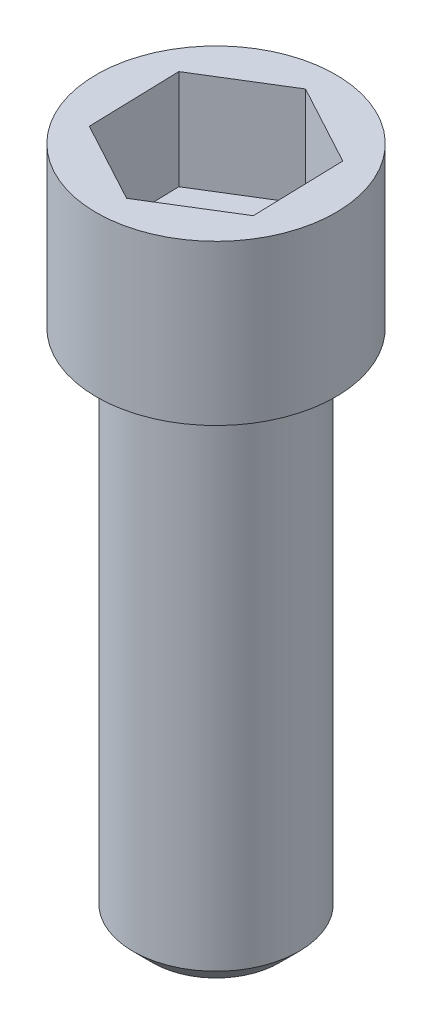
ISO-10303-21;
HEADER;
FILE_DESCRIPTION(('STEP AP214'),'2;1');
FILE_NAME('part.step','',(''),(''),'','','');
FILE_SCHEMA(('AUTOMOTIVE_DESIGN { 1 0 10303 214 1 1 1 1 }'));
ENDSEC;
DATA;
#1=APPLICATION_CONTEXT('core data for automotive mechanical design processes');
#2=APPLICATION_PROTOCOL_DEFINITION('international standard','automotive_design',2000,#1);
#3=PRODUCT_CONTEXT('',#1,'mechanical');
#4=PRODUCT('Part','Part','',(#3));
#5=PRODUCT_RELATED_PRODUCT_CATEGORY('part','',(#4));
#6=PRODUCT_DEFINITION_FORMATION('','',#4);
#7=PRODUCT_DEFINITION_CONTEXT('part definition',#1,'design');
#8=PRODUCT_DEFINITION('design','',#6,#7);
#9=PRODUCT_DEFINITION_SHAPE('','',#8);
#10=(LENGTH_UNIT() NAMED_UNIT(*) SI_UNIT(.MILLI.,.METRE.));
#11=(NAMED_UNIT(*) PLANE_ANGLE_UNIT() SI_UNIT($,.RADIAN.));
#12=(NAMED_UNIT(*) SI_UNIT($,.STERADIAN.) SOLID_ANGLE_UNIT());
#13=UNCERTAINTY_MEASURE_WITH_UNIT(LENGTH_MEASURE(1.E-05),#10,'distance_accuracy_value','');
#14=(GEOMETRIC_REPRESENTATION_CONTEXT(3) GLOBAL_UNCERTAINTY_ASSIGNED_CONTEXT((#13)) GLOBAL_UNIT_ASSIGNED_CONTEXT((#10,
#11,#12)) REPRESENTATION_CONTEXT('',''));
#15=CARTESIAN_POINT('',(0.,0.,0.));
#16=DIRECTION('',(0.,0.,1.));
#17=DIRECTION('',(1.,0.,0.));
#18=AXIS2_PLACEMENT_3D('',#15,#16,#17);
#19=CARTESIAN_POINT('',(0.,6.5,0.));
#20=DIRECTION('',(0.,-1.,0.));
#21=DIRECTION('',(0.,0.,-1.));
#22=AXIS2_PLACEMENT_3D('',#19,#20,#21);
#23=CYLINDRICAL_SURFACE('',#22,1.04);
#24=CARTESIAN_POINT('',(0.,0.250000000000005,0.));
#25=DIRECTION('',(0.,1.,0.));
#26=DIRECTION('',(0.,0.,1.));
#27=AXIS2_PLACEMENT_3D('',#24,#25,#26);
#28=CIRCLE('',#27,1.04);
#29=CARTESIAN_POINT('',(0.,0.250000000000005,-1.04));
#30=VERTEX_POINT('',#29);
#31=EDGE_CURVE('E40',#30,#30,#28,.T.);
#32=CARTESIAN_POINT('',(0.,6.5,0.));
#33=DIRECTION('',(0.,1.,0.));
#34=DIRECTION('',(0.,0.,1.));
#35=AXIS2_PLACEMENT_3D('',#32,#33,#34);
#36=CIRCLE('',#35,1.04);
#37=CARTESIAN_POINT('',(0.,6.5,-1.04));
#38=VERTEX_POINT('',#37);
#39=EDGE_CURVE('E143',#38,#38,#36,.T.);
#40=CARTESIAN_POINT('',(0.,0.250000000000005,-1.04));
#41=CARTESIAN_POINT('',(0.,0.315104166666672,-1.04));
#42=CARTESIAN_POINT('',(0.,0.380208333333339,-1.04));
#43=CARTESIAN_POINT('',(0.,0.510416666666672,-1.04));
#44=CARTESIAN_POINT('',(0.,0.575520833333338,-1.04));
#45=CARTESIAN_POINT('',(0.,0.705729166666672,-1.04));
#46=CARTESIAN_POINT('',(0.,0.770833333333338,-1.04));
#47=CARTESIAN_POINT('',(0.,0.901041666666672,-1.04));
#48=CARTESIAN_POINT('',(0.,0.966145833333338,-1.04));
#49=CARTESIAN_POINT('',(0.,1.09635416666667,-1.04));
#50=CARTESIAN_POINT('',(0.,1.16145833333334,-1.04));
#51=CARTESIAN_POINT('',(0.,1.29166666666667,-1.04));
#52=CARTESIAN_POINT('',(0.,1.35677083333334,-1.04));
#53=CARTESIAN_POINT('',(0.,1.48697916666667,-1.04));
#54=CARTESIAN_POINT('',(0.,1.55208333333334,-1.04));
#55=CARTESIAN_POINT('',(0.,1.68229166666667,-1.04));
#56=CARTESIAN_POINT('',(0.,1.74739583333334,-1.04));
#57=CARTESIAN_POINT('',(0.,1.87760416666667,-1.04));
#58=CARTESIAN_POINT('',(0.,1.94270833333334,-1.04));
#59=CARTESIAN_POINT('',(0.,2.07291666666667,-1.04));
#60=CARTESIAN_POINT('',(0.,2.13802083333334,-1.04));
#61=CARTESIAN_POINT('',(0.,2.26822916666667,-1.04));
#62=CARTESIAN_POINT('',(0.,2.33333333333334,-1.04));
#63=CARTESIAN_POINT('',(0.,2.46354166666667,-1.04));
#64=CARTESIAN_POINT('',(0.,2.52864583333334,-1.04));
#65=CARTESIAN_POINT('',(0.,2.65885416666667,-1.04));
#66=CARTESIAN_POINT('',(0.,2.72395833333334,-1.04));
#67=CARTESIAN_POINT('',(0.,2.85416666666667,-1.04));
#68=CARTESIAN_POINT('',(0.,2.91927083333334,-1.04));
#69=CARTESIAN_POINT('',(0.,3.04947916666667,-1.04));
#70=CARTESIAN_POINT('',(0.,3.11458333333334,-1.04));
#71=CARTESIAN_POINT('',(0.,3.24479166666667,-1.04));
#72=CARTESIAN_POINT('',(0.,3.30989583333334,-1.04));
#73=CARTESIAN_POINT('',(0.,3.44010416666667,-1.04));
#74=CARTESIAN_POINT('',(0.,3.50520833333334,-1.04));
#75=CARTESIAN_POINT('',(0.,3.63541666666667,-1.04));
#76=CARTESIAN_POINT('',(0.,3.70052083333334,-1.04));
#77=CARTESIAN_POINT('',(0.,3.83072916666667,-1.04));
#78=CARTESIAN_POINT('',(0.,3.89583333333334,-1.04));
#79=CARTESIAN_POINT('',(0.,4.02604166666667,-1.04));
#80=CARTESIAN_POINT('',(0.,4.09114583333334,-1.04));
#81=CARTESIAN_POINT('',(0.,4.22135416666667,-1.04));
#82=CARTESIAN_POINT('',(0.,4.28645833333333,-1.04));
#83=CARTESIAN_POINT('',(0.,4.41666666666667,-1.04));
#84=CARTESIAN_POINT('',(0.,4.48177083333333,-1.04));
#85=CARTESIAN_POINT('',(0.,4.61197916666667,-1.04));
#86=CARTESIAN_POINT('',(0.,4.67708333333333,-1.04));
#87=CARTESIAN_POINT('',(0.,4.80729166666667,-1.04));
#88=CARTESIAN_POINT('',(0.,4.87239583333333,-1.04));
#89=CARTESIAN_POINT('',(0.,5.00260416666667,-1.04));
#90=CARTESIAN_POINT('',(0.,5.06770833333333,-1.04));
#91=CARTESIAN_POINT('',(0.,5.19791666666667,-1.04));
#92=CARTESIAN_POINT('',(0.,5.26302083333333,-1.04));
#93=CARTESIAN_POINT('',(0.,5.39322916666667,-1.04));
#94=CARTESIAN_POINT('',(0.,5.45833333333333,-1.04));
#95=CARTESIAN_POINT('',(0.,5.58854166666667,-1.04));
#96=CARTESIAN_POINT('',(0.,5.65364583333333,-1.04));
#97=CARTESIAN_POINT('',(0.,5.78385416666667,-1.04));
#98=CARTESIAN_POINT('',(0.,5.84895833333333,-1.04));
#99=CARTESIAN_POINT('',(0.,5.97916666666667,-1.04));
#100=CARTESIAN_POINT('',(0.,6.04427083333333,-1.04));
#101=CARTESIAN_POINT('',(0.,6.17447916666667,-1.04));
#102=CARTESIAN_POINT('',(0.,6.23958333333333,-1.04));
#103=CARTESIAN_POINT('',(0.,6.36979166666667,-1.04));
#104=CARTESIAN_POINT('',(0.,6.43489583333333,-1.04));
#105=CARTESIAN_POINT('',(0.,6.5,-1.04));
#106=B_SPLINE_CURVE_WITH_KNOTS('',3,(#40,#41,#42,#43,#44,#45,#46,#47,#48,#49,#50,#51,#52,#53,
#54,#55,#56,#57,#58,#59,#60,#61,#62,#63,#64,#65,#66,#67,#68,#69,#70,#71,#72,#73,#74,#75,#76,#77,
#78,#79,#80,#81,#82,#83,#84,#85,#86,#87,#88,#89,#90,#91,#92,#93,#94,#95,#96,#97,#98,#99,#100,
#101,#102,#103,#104,#105),.UNSPECIFIED.,.F.,.F.,(4,2,2,2,2,2,2,2,2,2,2,2,2,2,2,2,2,2,2,2,2,2,2,
2,2,2,2,2,2,2,2,2,4),(0.,0.1953125,0.390625,0.5859375,0.781249999999999,0.976562499999999,
1.171875,1.3671875,1.5625,1.7578125,1.953125,2.1484375,2.34375,2.5390625,2.734375,2.9296875,
3.125,3.3203125,3.515625,3.7109375,3.90625,4.1015625,4.296875,4.4921875,4.6875,4.8828125,
5.07812499999999,5.2734375,5.46875,5.66406249999999,5.85937499999999,6.05468749999999,
6.24999999999999),.UNSPECIFIED.);
#107=EDGE_CURVE('BSEAM32',#30,#38,#106,.T.);
#108=ORIENTED_EDGE('',*,*,#31,.T.);
#109=ORIENTED_EDGE('',*,*,#39,.F.);
#110=ORIENTED_EDGE('',*,*,#107,.T.);
#111=ORIENTED_EDGE('',*,*,#107,.F.);
#112=EDGE_LOOP('',(#108,#110,#109,#111));
#113=FACE_BOUND('',#112,.T.);
#114=ADVANCED_FACE('F32',(#113),#23,.T.);
#115=CARTESIAN_POINT('',(0.,0.,0.));
#116=DIRECTION('',(0.,1.,0.));
#117=DIRECTION('',(0.,0.,1.));
#118=AXIS2_PLACEMENT_3D('',#115,#116,#117);
#119=PLANE('',#118);
#120=CARTESIAN_POINT('',(0.,0.,0.));
#121=DIRECTION('',(0.,1.,0.));
#122=DIRECTION('',(0.,0.,1.));
#123=AXIS2_PLACEMENT_3D('',#120,#121,#122);
#124=CIRCLE('',#123,0.789999999999994);
#125=CARTESIAN_POINT('',(0.,0.,0.789999999999994));
#126=VERTEX_POINT('',#125);
#127=EDGE_CURVE('E11',#126,#126,#124,.F.);
#128=ORIENTED_EDGE('',*,*,#127,.T.);
#129=EDGE_LOOP('',(#128));
#130=FACE_BOUND('',#129,.T.);
#131=ADVANCED_FACE('F161',(#130),#119,.F.);
#132=CARTESIAN_POINT('',(0.,8.5,0.));
#133=DIRECTION('',(0.,-1.,0.));
#134=DIRECTION('',(0.,0.,-1.));
#135=AXIS2_PLACEMENT_3D('',#132,#133,#134);
#136=CYLINDRICAL_SURFACE('',#135,1.5);
#137=CARTESIAN_POINT('',(0.,8.5,0.));
#138=DIRECTION('',(0.,1.,0.));
#139=DIRECTION('',(0.,0.,1.));
#140=AXIS2_PLACEMENT_3D('',#137,#138,#139);
#141=CIRCLE('',#140,1.5);
#142=CARTESIAN_POINT('',(0.,8.5,1.5));
#143=VERTEX_POINT('',#142);
#144=EDGE_CURVE('E140',#143,#143,#141,.T.);
#145=ORIENTED_EDGE('',*,*,#144,.F.);
#146=EDGE_LOOP('',(#145));
#147=FACE_BOUND('',#146,.T.);
#148=CARTESIAN_POINT('',(0.,6.5,0.));
#149=DIRECTION('',(0.,1.,0.));
#150=DIRECTION('',(0.,0.,1.));
#151=AXIS2_PLACEMENT_3D('',#148,#149,#150);
#152=CIRCLE('',#151,1.5);
#153=CARTESIAN_POINT('',(0.,6.5,1.5));
#154=VERTEX_POINT('',#153);
#155=EDGE_CURVE('E134',#154,#154,#152,.T.);
#156=ORIENTED_EDGE('',*,*,#155,.T.);
#157=EDGE_LOOP('',(#156));
#158=FACE_BOUND('',#157,.T.);
#159=ADVANCED_FACE('F165',(#147,#158),#136,.T.);
#160=CARTESIAN_POINT('',(0.,8.5,0.));
#161=DIRECTION('',(0.,1.,0.));
#162=DIRECTION('',(0.,0.,1.));
#163=AXIS2_PLACEMENT_3D('',#160,#161,#162);
#164=PLANE('',#163);
#165=DIRECTION('',(-0.879869485296028,0.,-0.475215413096947));
#166=VECTOR('',#165,1.);
#167=CARTESIAN_POINT('',(0.983208297284347,8.5,-0.605503738621446));
#168=LINE('',#167,#166);
#169=CARTESIAN_POINT('',(0.983208297284347,8.5,-0.605503738621446));
#170=VERTEX_POINT('',#169);
#171=CARTESIAN_POINT('',(-0.0327774710904521,8.5,-1.15423523197061));
#172=VERTEX_POINT('',#171);
#173=EDGE_CURVE('E47',#170,#172,#168,.T.);
#174=ORIENTED_EDGE('',*,*,#173,.F.);
#175=DIRECTION('',(-0.0283861226361414,0.,-0.999597032829573));
#176=VECTOR('',#175,1.);
#177=CARTESIAN_POINT('',(1.0159857683748,8.5,0.548731493349163));
#178=LINE('',#177,#176);
#179=CARTESIAN_POINT('',(1.0159857683748,8.5,0.548731493349163));
#180=VERTEX_POINT('',#179);
#181=EDGE_CURVE('E130',#180,#170,#178,.T.);
#182=ORIENTED_EDGE('',*,*,#181,.F.);
#183=DIRECTION('',(0.851483362659887,0.,-0.524381619732625));
#184=VECTOR('',#183,1.);
#185=CARTESIAN_POINT('',(0.0327774710904519,8.5,1.15423523197061));
#186=LINE('',#185,#184);
#187=CARTESIAN_POINT('',(0.0327774710904519,8.5,1.15423523197061));
#188=VERTEX_POINT('',#187);
#189=EDGE_CURVE('E128',#188,#180,#186,.T.);
#190=ORIENTED_EDGE('',*,*,#189,.F.);
#191=DIRECTION('',(0.879869485296028,0.,0.475215413096947));
#192=VECTOR('',#191,1.);
#193=CARTESIAN_POINT('',(-0.983208297284346,8.5,0.605503738621447));
#194=LINE('',#193,#192);
#195=CARTESIAN_POINT('',(-0.983208297284346,8.5,0.605503738621447));
#196=VERTEX_POINT('',#195);
#197=EDGE_CURVE('E95',#196,#188,#194,.T.);
#198=ORIENTED_EDGE('',*,*,#197,.F.);
#199=DIRECTION('',(0.0283861226361416,0.,0.999597032829573));
#200=VECTOR('',#199,1.);
#201=CARTESIAN_POINT('',(-1.0159857683748,8.5,-0.548731493349163));
#202=LINE('',#201,#200);
#203=CARTESIAN_POINT('',(-1.0159857683748,8.5,-0.548731493349163));
#204=VERTEX_POINT('',#203);
#205=EDGE_CURVE('E124',#204,#196,#202,.T.);
#206=ORIENTED_EDGE('',*,*,#205,.F.);
#207=DIRECTION('',(-0.851483362659887,0.,0.524381619732626));
#208=VECTOR('',#207,1.);
#209=CARTESIAN_POINT('',(-0.0327774710904521,8.5,-1.15423523197061));
#210=LINE('',#209,#208);
#211=EDGE_CURVE('E121',#172,#204,#210,.T.);
#212=ORIENTED_EDGE('',*,*,#211,.F.);
#213=EDGE_LOOP('',(#174,#182,#190,#198,#206,#212));
#214=FACE_BOUND('',#213,.T.);
#215=ORIENTED_EDGE('',*,*,#144,.T.);
#216=EDGE_LOOP('',(#215));
#217=FACE_BOUND('',#216,.T.);
#218=ADVANCED_FACE('F171',(#214,#217),#164,.T.);
#219=CARTESIAN_POINT('',(0.,6.5,0.));
#220=DIRECTION('',(0.,1.,0.));
#221=DIRECTION('',(0.,0.,1.));
#222=AXIS2_PLACEMENT_3D('',#219,#220,#221);
#223=PLANE('',#222);
#224=ORIENTED_EDGE('',*,*,#39,.T.);
#225=EDGE_LOOP('',(#224));
#226=FACE_BOUND('',#225,.T.);
#227=ORIENTED_EDGE('',*,*,#155,.F.);
#228=EDGE_LOOP('',(#227));
#229=FACE_BOUND('',#228,.T.);
#230=ADVANCED_FACE('F173',(#226,#229),#223,.F.);
#231=CARTESIAN_POINT('',(0.983208297284347,7.25,-0.605503738621446));
#232=DIRECTION('',(0.475215413096947,0.,-0.879869485296028));
#233=DIRECTION('',(-0.879869485296028,0.,-0.475215413096947));
#234=AXIS2_PLACEMENT_3D('',#231,#232,#233);
#235=PLANE('',#234);
#236=ORIENTED_EDGE('',*,*,#173,.T.);
#237=DIRECTION('',(0.,1.,0.));
#238=VECTOR('',#237,1.);
#239=CARTESIAN_POINT('',(-0.0327774710904521,7.25,-1.15423523197061));
#240=LINE('',#239,#238);
#241=CARTESIAN_POINT('',(-0.0327774710904521,7.25,-1.15423523197061));
#242=VERTEX_POINT('',#241);
#243=EDGE_CURVE('E77',#242,#172,#240,.T.);
#244=ORIENTED_EDGE('',*,*,#243,.F.);
#245=DIRECTION('',(-0.879869485296028,0.,-0.475215413096947));
#246=VECTOR('',#245,1.);
#247=CARTESIAN_POINT('',(0.983208297284347,7.25,-0.605503738621446));
#248=LINE('',#247,#246);
#249=CARTESIAN_POINT('',(0.983208297284347,7.25,-0.605503738621446));
#250=VERTEX_POINT('',#249);
#251=EDGE_CURVE('E132',#250,#242,#248,.T.);
#252=ORIENTED_EDGE('',*,*,#251,.F.);
#253=DIRECTION('',(0.,1.,0.));
#254=VECTOR('',#253,1.);
#255=CARTESIAN_POINT('',(0.983208297284347,7.25,-0.605503738621446));
#256=LINE('',#255,#254);
#257=EDGE_CURVE('E55',#250,#170,#256,.T.);
#258=ORIENTED_EDGE('',*,*,#257,.T.);
#259=EDGE_LOOP('',(#236,#244,#252,#258));
#260=FACE_BOUND('',#259,.T.);
#261=ADVANCED_FACE('F176',(#260),#235,.F.);
#262=CARTESIAN_POINT('',(1.0159857683748,7.25,0.548731493349163));
#263=DIRECTION('',(0.999597032829573,0.,-0.0283861226361414));
#264=DIRECTION('',(-0.0283861226361414,0.,-0.999597032829573));
#265=AXIS2_PLACEMENT_3D('',#262,#263,#264);
#266=PLANE('',#265);
#267=ORIENTED_EDGE('',*,*,#181,.T.);
#268=ORIENTED_EDGE('',*,*,#257,.F.);
#269=DIRECTION('',(-0.0283861226361414,0.,-0.999597032829573));
#270=VECTOR('',#269,1.);
#271=CARTESIAN_POINT('',(1.0159857683748,7.25,0.548731493349163));
#272=LINE('',#271,#270);
#273=CARTESIAN_POINT('',(1.0159857683748,7.25,0.548731493349163));
#274=VERTEX_POINT('',#273);
#275=EDGE_CURVE('E107',#274,#250,#272,.T.);
#276=ORIENTED_EDGE('',*,*,#275,.F.);
#277=DIRECTION('',(0.,1.,0.));
#278=VECTOR('',#277,1.);
#279=CARTESIAN_POINT('',(1.0159857683748,7.25,0.548731493349163));
#280=LINE('',#279,#278);
#281=EDGE_CURVE('E99',#274,#180,#280,.T.);
#282=ORIENTED_EDGE('',*,*,#281,.T.);
#283=EDGE_LOOP('',(#267,#268,#276,#282));
#284=FACE_BOUND('',#283,.T.);
#285=ADVANCED_FACE('F183',(#284),#266,.F.);
#286=CARTESIAN_POINT('',(0.0327774710904519,7.25,1.15423523197061));
#287=DIRECTION('',(0.524381619732625,0.,0.851483362659887));
#288=DIRECTION('',(0.851483362659887,0.,-0.524381619732625));
#289=AXIS2_PLACEMENT_3D('',#286,#287,#288);
#290=PLANE('',#289);
#291=ORIENTED_EDGE('',*,*,#189,.T.);
#292=ORIENTED_EDGE('',*,*,#281,.F.);
#293=DIRECTION('',(0.851483362659887,0.,-0.524381619732625));
#294=VECTOR('',#293,1.);
#295=CARTESIAN_POINT('',(0.0327774710904519,7.25,1.15423523197061));
#296=LINE('',#295,#294);
#297=CARTESIAN_POINT('',(0.0327774710904519,7.25,1.15423523197061));
#298=VERTEX_POINT('',#297);
#299=EDGE_CURVE('E103',#298,#274,#296,.T.);
#300=ORIENTED_EDGE('',*,*,#299,.F.);
#301=DIRECTION('',(0.,1.,0.));
#302=VECTOR('',#301,1.);
#303=CARTESIAN_POINT('',(0.0327774710904519,7.25,1.15423523197061));
#304=LINE('',#303,#302);
#305=EDGE_CURVE('E88',#298,#188,#304,.T.);
#306=ORIENTED_EDGE('',*,*,#305,.T.);
#307=EDGE_LOOP('',(#291,#292,#300,#306));
#308=FACE_BOUND('',#307,.T.);
#309=ADVANCED_FACE('F104',(#308),#290,.F.);
#310=CARTESIAN_POINT('',(-0.983208297284346,7.25,0.605503738621447));
#311=DIRECTION('',(-0.475215413096947,0.,0.879869485296028));
#312=DIRECTION('',(0.879869485296028,0.,0.475215413096947));
#313=AXIS2_PLACEMENT_3D('',#310,#311,#312);
#314=PLANE('',#313);
#315=ORIENTED_EDGE('',*,*,#197,.T.);
#316=ORIENTED_EDGE('',*,*,#305,.F.);
#317=DIRECTION('',(0.879869485296028,0.,0.475215413096947));
#318=VECTOR('',#317,1.);
#319=CARTESIAN_POINT('',(-0.983208297284346,7.25,0.605503738621447));
#320=LINE('',#319,#318);
#321=CARTESIAN_POINT('',(-0.983208297284346,7.25,0.605503738621447));
#322=VERTEX_POINT('',#321);
#323=EDGE_CURVE('E92',#322,#298,#320,.T.);
#324=ORIENTED_EDGE('',*,*,#323,.F.);
#325=DIRECTION('',(0.,1.,0.));
#326=VECTOR('',#325,1.);
#327=CARTESIAN_POINT('',(-0.983208297284346,7.25,0.605503738621447));
#328=LINE('',#327,#326);
#329=EDGE_CURVE('E100',#322,#196,#328,.T.);
#330=ORIENTED_EDGE('',*,*,#329,.T.);
#331=EDGE_LOOP('',(#315,#316,#324,#330));
#332=FACE_BOUND('',#331,.T.);
#333=ADVANCED_FACE('F90',(#332),#314,.F.);
#334=CARTESIAN_POINT('',(-1.0159857683748,7.25,-0.548731493349163));
#335=DIRECTION('',(-0.999597032829573,0.,0.0283861226361416));
#336=DIRECTION('',(0.0283861226361416,0.,0.999597032829573));
#337=AXIS2_PLACEMENT_3D('',#334,#335,#336);
#338=PLANE('',#337);
#339=ORIENTED_EDGE('',*,*,#205,.T.);
#340=ORIENTED_EDGE('',*,*,#329,.F.);
#341=DIRECTION('',(0.0283861226361416,0.,0.999597032829573));
#342=VECTOR('',#341,1.);
#343=CARTESIAN_POINT('',(-1.0159857683748,7.25,-0.548731493349163));
#344=LINE('',#343,#342);
#345=CARTESIAN_POINT('',(-1.0159857683748,7.25,-0.548731493349163));
#346=VERTEX_POINT('',#345);
#347=EDGE_CURVE('E113',#346,#322,#344,.T.);
#348=ORIENTED_EDGE('',*,*,#347,.F.);
#349=DIRECTION('',(0.,1.,0.));
#350=VECTOR('',#349,1.);
#351=CARTESIAN_POINT('',(-1.0159857683748,7.25,-0.548731493349163));
#352=LINE('',#351,#350);
#353=EDGE_CURVE('E137',#346,#204,#352,.T.);
#354=ORIENTED_EDGE('',*,*,#353,.T.);
#355=EDGE_LOOP('',(#339,#340,#348,#354));
#356=FACE_BOUND('',#355,.T.);
#357=ADVANCED_FACE('F186',(#356),#338,.F.);
#358=CARTESIAN_POINT('',(-0.0327774710904521,7.25,-1.15423523197061));
#359=DIRECTION('',(-0.524381619732626,0.,-0.851483362659887));
#360=DIRECTION('',(-0.851483362659887,0.,0.524381619732626));
#361=AXIS2_PLACEMENT_3D('',#358,#359,#360);
#362=PLANE('',#361);
#363=ORIENTED_EDGE('',*,*,#211,.T.);
#364=ORIENTED_EDGE('',*,*,#353,.F.);
#365=DIRECTION('',(-0.851483362659887,0.,0.524381619732626));
#366=VECTOR('',#365,1.);
#367=CARTESIAN_POINT('',(-0.0327774710904521,7.25,-1.15423523197061));
#368=LINE('',#367,#366);
#369=EDGE_CURVE('E115',#242,#346,#368,.T.);
#370=ORIENTED_EDGE('',*,*,#369,.F.);
#371=ORIENTED_EDGE('',*,*,#243,.T.);
#372=EDGE_LOOP('',(#363,#364,#370,#371));
#373=FACE_BOUND('',#372,.T.);
#374=ADVANCED_FACE('F157',(#373),#362,.F.);
#375=CARTESIAN_POINT('',(0.,7.25,0.));
#376=DIRECTION('',(0.,1.,0.));
#377=DIRECTION('',(0.,0.,1.));
#378=AXIS2_PLACEMENT_3D('',#375,#376,#377);
#379=PLANE('',#378);
#380=ORIENTED_EDGE('',*,*,#251,.T.);
#381=ORIENTED_EDGE('',*,*,#369,.T.);
#382=ORIENTED_EDGE('',*,*,#347,.T.);
#383=ORIENTED_EDGE('',*,*,#323,.T.);
#384=ORIENTED_EDGE('',*,*,#299,.T.);
#385=ORIENTED_EDGE('',*,*,#275,.T.);
#386=EDGE_LOOP('',(#380,#381,#382,#383,#384,#385));
#387=FACE_BOUND('',#386,.T.);
#388=ADVANCED_FACE('F110',(#387),#379,.T.);
#389=CARTESIAN_POINT('',(0.,0.250000000000005,0.));
#390=DIRECTION('',(0.,1.,0.));
#391=DIRECTION('',(0.,0.,1.));
#392=AXIS2_PLACEMENT_3D('',#389,#390,#391);
#393=CONICAL_SURFACE('',#392,1.04,0.78539816339745);
#394=ORIENTED_EDGE('',*,*,#127,.F.);
#395=EDGE_LOOP('',(#394));
#396=FACE_BOUND('',#395,.T.);
#397=ORIENTED_EDGE('',*,*,#31,.F.);
#398=EDGE_LOOP('',(#397));
#399=FACE_BOUND('',#398,.T.);
#400=ADVANCED_FACE('F34',(#396,#399),#393,.T.);
#401=CLOSED_SHELL('',(#114,#131,#159,#218,#230,#261,#285,#309,#333,#357,#374,#388,#400));
#402=MANIFOLD_SOLID_BREP('B2',#401);
#403=ADVANCED_BREP_SHAPE_REPRESENTATION('',(#18,#402),#14);
#404=SHAPE_DEFINITION_REPRESENTATION(#9,#403);
ENDSEC;
END-ISO-10303-21;
